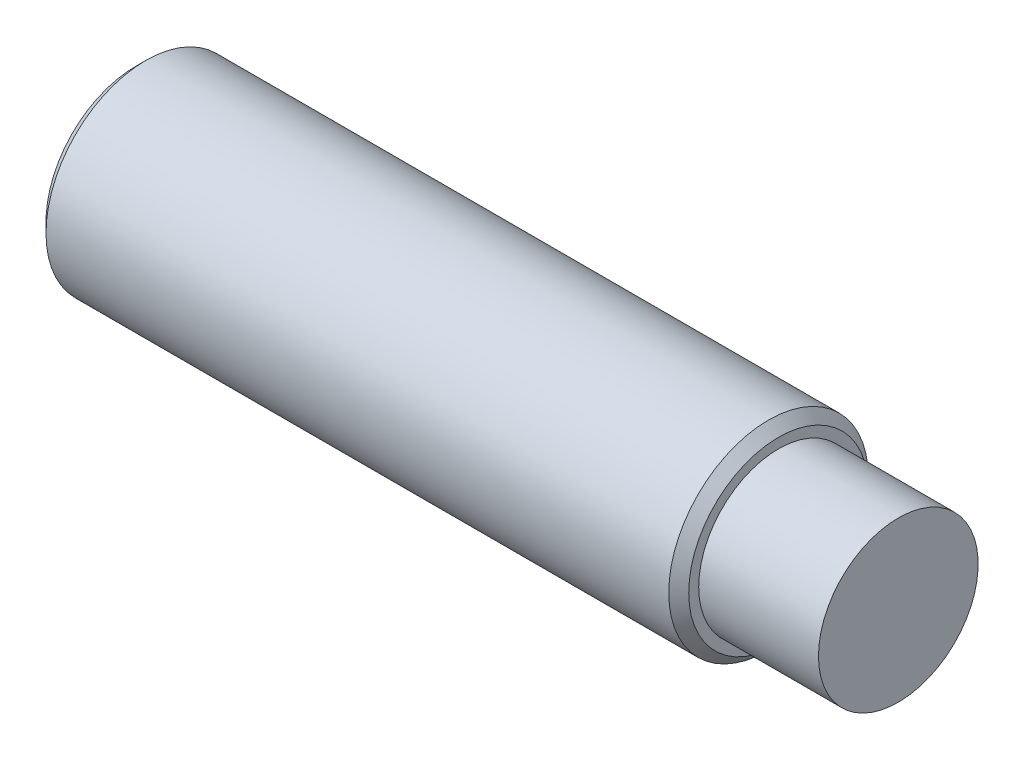
ISO-10303-21;
HEADER;
FILE_DESCRIPTION(('STEP AP214'),'2;1');
FILE_NAME('part.step','',(''),(''),'','','');
FILE_SCHEMA(('AUTOMOTIVE_DESIGN { 1 0 10303 214 1 1 1 1 }'));
ENDSEC;
DATA;
#1=APPLICATION_CONTEXT('core data for automotive mechanical design processes');
#2=APPLICATION_PROTOCOL_DEFINITION('international standard','automotive_design',2000,#1);
#3=PRODUCT_CONTEXT('',#1,'mechanical');
#4=PRODUCT('Part','Part','',(#3));
#5=PRODUCT_RELATED_PRODUCT_CATEGORY('part','',(#4));
#6=PRODUCT_DEFINITION_FORMATION('','',#4);
#7=PRODUCT_DEFINITION_CONTEXT('part definition',#1,'design');
#8=PRODUCT_DEFINITION('design','',#6,#7);
#9=PRODUCT_DEFINITION_SHAPE('','',#8);
#10=(LENGTH_UNIT() NAMED_UNIT(*) SI_UNIT(.MILLI.,.METRE.));
#11=(NAMED_UNIT(*) PLANE_ANGLE_UNIT() SI_UNIT($,.RADIAN.));
#12=(NAMED_UNIT(*) SI_UNIT($,.STERADIAN.) SOLID_ANGLE_UNIT());
#13=UNCERTAINTY_MEASURE_WITH_UNIT(LENGTH_MEASURE(1.E-05),#10,'distance_accuracy_value','');
#14=(GEOMETRIC_REPRESENTATION_CONTEXT(3) GLOBAL_UNCERTAINTY_ASSIGNED_CONTEXT((#13)) GLOBAL_UNIT_ASSIGNED_CONTEXT((#10,
#11,#12)) REPRESENTATION_CONTEXT('',''));
#15=CARTESIAN_POINT('',(0.,0.,0.));
#16=DIRECTION('',(0.,0.,1.));
#17=DIRECTION('',(1.,0.,0.));
#18=AXIS2_PLACEMENT_3D('',#15,#16,#17);
#19=CARTESIAN_POINT('',(0.,0.,0.));
#20=DIRECTION('',(1.,0.,0.));
#21=DIRECTION('',(0.,0.,-1.));
#22=AXIS2_PLACEMENT_3D('',#19,#20,#21);
#23=PLANE('',#22);
#24=CARTESIAN_POINT('',(0.,0.,0.));
#25=DIRECTION('',(-1.,0.,0.));
#26=DIRECTION('',(0.,0.,1.));
#27=AXIS2_PLACEMENT_3D('',#24,#25,#26);
#28=CIRCLE('',#27,2.);
#29=CARTESIAN_POINT('',(0.,0.,2.));
#30=VERTEX_POINT('',#29);
#31=EDGE_CURVE('E73',#30,#30,#28,.T.);
#32=ORIENTED_EDGE('',*,*,#31,.F.);
#33=EDGE_LOOP('',(#32));
#34=FACE_BOUND('',#33,.T.);
#35=CARTESIAN_POINT('',(0.,0.,0.));
#36=DIRECTION('',(1.,0.,0.));
#37=DIRECTION('',(0.,0.,-1.));
#38=AXIS2_PLACEMENT_3D('',#35,#36,#37);
#39=CIRCLE('',#38,4.5);
#40=CARTESIAN_POINT('',(0.,0.,-4.5));
#41=VERTEX_POINT('',#40);
#42=EDGE_CURVE('E10',#41,#41,#39,.F.);
#43=ORIENTED_EDGE('',*,*,#42,.T.);
#44=EDGE_LOOP('',(#43));
#45=FACE_BOUND('',#44,.T.);
#46=ADVANCED_FACE('F39',(#34,#45),#23,.F.);
#47=CARTESIAN_POINT('',(-21.6251223316182,0.,0.));
#48=DIRECTION('',(-1.,0.,0.));
#49=DIRECTION('',(0.,0.,1.));
#50=AXIS2_PLACEMENT_3D('',#47,#48,#49);
#51=CYLINDRICAL_SURFACE('',#50,5.);
#52=CARTESIAN_POINT('',(31.7,0.,0.));
#53=DIRECTION('',(-1.,0.,0.));
#54=DIRECTION('',(0.,0.,1.));
#55=AXIS2_PLACEMENT_3D('',#52,#53,#54);
#56=CIRCLE('',#55,5.);
#57=CARTESIAN_POINT('',(31.7,0.,5.));
#58=VERTEX_POINT('',#57);
#59=EDGE_CURVE('E53',#58,#58,#56,.T.);
#60=ORIENTED_EDGE('',*,*,#59,.T.);
#61=EDGE_LOOP('',(#60));
#62=FACE_BOUND('',#61,.T.);
#63=CARTESIAN_POINT('',(0.500000000000007,0.,0.));
#64=DIRECTION('',(1.,0.,0.));
#65=DIRECTION('',(0.,0.,-1.));
#66=AXIS2_PLACEMENT_3D('',#63,#64,#65);
#67=CIRCLE('',#66,5.);
#68=CARTESIAN_POINT('',(0.500000000000007,0.,-5.));
#69=VERTEX_POINT('',#68);
#70=EDGE_CURVE('E58',#69,#69,#67,.T.);
#71=ORIENTED_EDGE('',*,*,#70,.T.);
#72=EDGE_LOOP('',(#71));
#73=FACE_BOUND('',#72,.T.);
#74=ADVANCED_FACE('F90',(#62,#73),#51,.T.);
#75=CARTESIAN_POINT('',(32.2,5.,0.));
#76=DIRECTION('',(-1.,0.,0.));
#77=DIRECTION('',(0.,0.,1.));
#78=AXIS2_PLACEMENT_3D('',#75,#76,#77);
#79=PLANE('',#78);
#80=CARTESIAN_POINT('',(32.2,0.,0.));
#81=DIRECTION('',(-1.,0.,0.));
#82=DIRECTION('',(0.,0.,1.));
#83=AXIS2_PLACEMENT_3D('',#80,#81,#82);
#84=CIRCLE('',#83,4.5);
#85=CARTESIAN_POINT('',(32.2,0.,4.5));
#86=VERTEX_POINT('',#85);
#87=EDGE_CURVE('E48',#86,#86,#84,.F.);
#88=ORIENTED_EDGE('',*,*,#87,.T.);
#89=EDGE_LOOP('',(#88));
#90=FACE_BOUND('',#89,.T.);
#91=CARTESIAN_POINT('',(32.2,0.,0.));
#92=DIRECTION('',(-1.,0.,0.));
#93=DIRECTION('',(0.,0.,1.));
#94=AXIS2_PLACEMENT_3D('',#91,#92,#93);
#95=CIRCLE('',#94,4.);
#96=CARTESIAN_POINT('',(32.2,0.,4.));
#97=VERTEX_POINT('',#96);
#98=EDGE_CURVE('E64',#97,#97,#95,.T.);
#99=ORIENTED_EDGE('',*,*,#98,.T.);
#100=EDGE_LOOP('',(#99));
#101=FACE_BOUND('',#100,.T.);
#102=ADVANCED_FACE('F95',(#90,#101),#79,.F.);
#103=CARTESIAN_POINT('',(-21.6251223316182,0.,0.));
#104=DIRECTION('',(-1.,0.,0.));
#105=DIRECTION('',(0.,0.,1.));
#106=AXIS2_PLACEMENT_3D('',#103,#104,#105);
#107=CYLINDRICAL_SURFACE('',#106,4.);
#108=ORIENTED_EDGE('',*,*,#98,.F.);
#109=EDGE_LOOP('',(#108));
#110=FACE_BOUND('',#109,.T.);
#111=CARTESIAN_POINT('',(38.2,0.,0.));
#112=DIRECTION('',(-1.,0.,0.));
#113=DIRECTION('',(0.,0.,1.));
#114=AXIS2_PLACEMENT_3D('',#111,#112,#113);
#115=CIRCLE('',#114,4.);
#116=CARTESIAN_POINT('',(38.2,0.,4.));
#117=VERTEX_POINT('',#116);
#118=EDGE_CURVE('E68',#117,#117,#115,.T.);
#119=ORIENTED_EDGE('',*,*,#118,.T.);
#120=EDGE_LOOP('',(#119));
#121=FACE_BOUND('',#120,.T.);
#122=ADVANCED_FACE('F111',(#110,#121),#107,.T.);
#123=CARTESIAN_POINT('',(38.2,4.,0.));
#124=DIRECTION('',(-1.,0.,0.));
#125=DIRECTION('',(0.,0.,1.));
#126=AXIS2_PLACEMENT_3D('',#123,#124,#125);
#127=PLANE('',#126);
#128=ORIENTED_EDGE('',*,*,#118,.F.);
#129=EDGE_LOOP('',(#128));
#130=FACE_BOUND('',#129,.T.);
#131=ADVANCED_FACE('F104',(#130),#127,.F.);
#132=CARTESIAN_POINT('',(31.7,0.,0.));
#133=DIRECTION('',(-1.,0.,0.));
#134=DIRECTION('',(0.,0.,1.));
#135=AXIS2_PLACEMENT_3D('',#132,#133,#134);
#136=CONICAL_SURFACE('',#135,5.,0.785398163397447);
#137=ORIENTED_EDGE('',*,*,#87,.F.);
#138=EDGE_LOOP('',(#137));
#139=FACE_BOUND('',#138,.T.);
#140=ORIENTED_EDGE('',*,*,#59,.F.);
#141=EDGE_LOOP('',(#140));
#142=FACE_BOUND('',#141,.T.);
#143=ADVANCED_FACE('F100',(#139,#142),#136,.T.);
#144=CARTESIAN_POINT('',(0.,0.,0.));
#145=DIRECTION('',(1.,0.,0.));
#146=DIRECTION('',(0.,0.,-1.));
#147=AXIS2_PLACEMENT_3D('',#144,#145,#146);
#148=CONICAL_SURFACE('',#147,4.5,0.785398163397444);
#149=ORIENTED_EDGE('',*,*,#70,.F.);
#150=EDGE_LOOP('',(#149));
#151=FACE_BOUND('',#150,.T.);
#152=ORIENTED_EDGE('',*,*,#42,.F.);
#153=EDGE_LOOP('',(#152));
#154=FACE_BOUND('',#153,.T.);
#155=ADVANCED_FACE('F42',(#151,#154),#148,.T.);
#156=CARTESIAN_POINT('',(10.,0.,0.));
#157=DIRECTION('',(-1.,0.,0.));
#158=DIRECTION('',(0.,0.,1.));
#159=AXIS2_PLACEMENT_3D('',#156,#157,#158);
#160=CYLINDRICAL_SURFACE('',#159,2.);
#161=CARTESIAN_POINT('',(10.,0.,0.));
#162=DIRECTION('',(-1.,0.,0.));
#163=DIRECTION('',(0.,0.,1.));
#164=AXIS2_PLACEMENT_3D('',#161,#162,#163);
#165=CIRCLE('',#164,2.);
#166=CARTESIAN_POINT('',(10.,0.,2.));
#167=VERTEX_POINT('',#166);
#168=EDGE_CURVE('E72',#167,#167,#165,.T.);
#169=ORIENTED_EDGE('',*,*,#168,.F.);
#170=EDGE_LOOP('',(#169));
#171=FACE_BOUND('',#170,.T.);
#172=ORIENTED_EDGE('',*,*,#31,.T.);
#173=EDGE_LOOP('',(#172));
#174=FACE_BOUND('',#173,.T.);
#175=ADVANCED_FACE('F83',(#171,#174),#160,.F.);
#176=CARTESIAN_POINT('',(10.,0.,0.));
#177=DIRECTION('',(-1.,0.,0.));
#178=DIRECTION('',(0.,0.,1.));
#179=AXIS2_PLACEMENT_3D('',#176,#177,#178);
#180=PLANE('',#179);
#181=ORIENTED_EDGE('',*,*,#168,.T.);
#182=EDGE_LOOP('',(#181));
#183=FACE_BOUND('',#182,.T.);
#184=ADVANCED_FACE('F81',(#183),#180,.T.);
#185=CLOSED_SHELL('',(#46,#74,#102,#122,#131,#143,#155,#175,#184));
#186=MANIFOLD_SOLID_BREP('B2',#185);
#187=ADVANCED_BREP_SHAPE_REPRESENTATION('',(#18,#186),#14);
#188=SHAPE_DEFINITION_REPRESENTATION(#9,#187);
ENDSEC;
END-ISO-10303-21;
